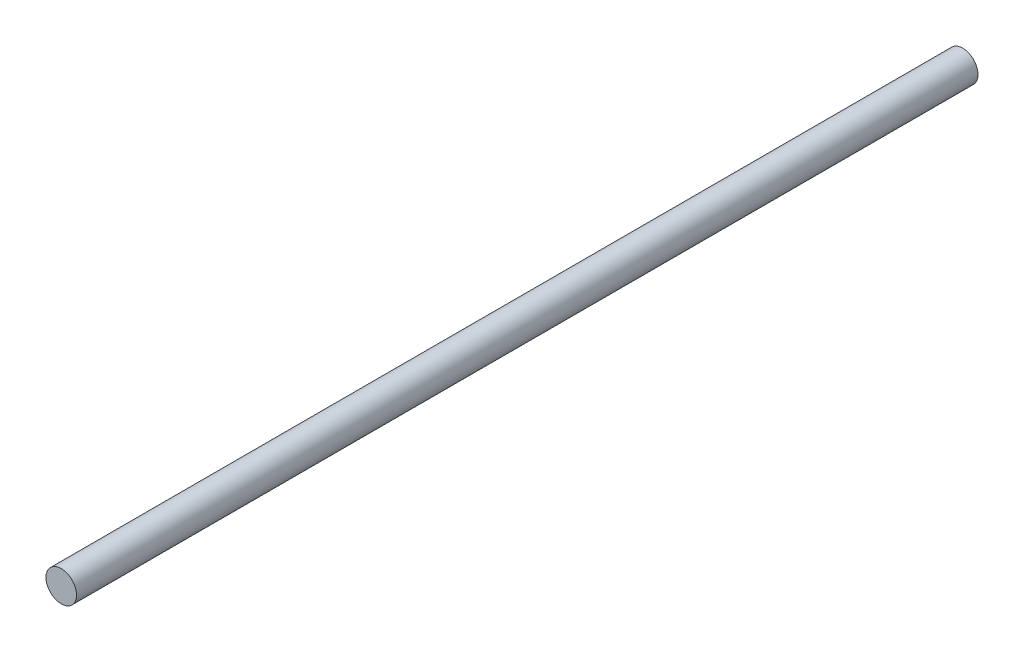
ISO-10303-21;
HEADER;
FILE_DESCRIPTION(('STEP AP214'),'2;1');
FILE_NAME('part.step','',(''),(''),'','','');
FILE_SCHEMA(('AUTOMOTIVE_DESIGN { 1 0 10303 214 1 1 1 1 }'));
ENDSEC;
DATA;
#1=APPLICATION_CONTEXT('core data for automotive mechanical design processes');
#2=APPLICATION_PROTOCOL_DEFINITION('international standard','automotive_design',2000,#1);
#3=PRODUCT_CONTEXT('',#1,'mechanical');
#4=PRODUCT('Part','Part','',(#3));
#5=PRODUCT_RELATED_PRODUCT_CATEGORY('part','',(#4));
#6=PRODUCT_DEFINITION_FORMATION('','',#4);
#7=PRODUCT_DEFINITION_CONTEXT('part definition',#1,'design');
#8=PRODUCT_DEFINITION('design','',#6,#7);
#9=PRODUCT_DEFINITION_SHAPE('','',#8);
#10=(LENGTH_UNIT() NAMED_UNIT(*) SI_UNIT(.MILLI.,.METRE.));
#11=(NAMED_UNIT(*) PLANE_ANGLE_UNIT() SI_UNIT($,.RADIAN.));
#12=(NAMED_UNIT(*) SI_UNIT($,.STERADIAN.) SOLID_ANGLE_UNIT());
#13=UNCERTAINTY_MEASURE_WITH_UNIT(LENGTH_MEASURE(1.E-05),#10,'distance_accuracy_value','');
#14=(GEOMETRIC_REPRESENTATION_CONTEXT(3) GLOBAL_UNCERTAINTY_ASSIGNED_CONTEXT((#13)) GLOBAL_UNIT_ASSIGNED_CONTEXT((#10,
#11,#12)) REPRESENTATION_CONTEXT('',''));
#15=CARTESIAN_POINT('',(0.,0.,0.));
#16=DIRECTION('',(0.,0.,1.));
#17=DIRECTION('',(1.,0.,0.));
#18=AXIS2_PLACEMENT_3D('',#15,#16,#17);
#19=CARTESIAN_POINT('',(11.5000000000011,-184.674624292413,-270.));
#20=DIRECTION('',(0.,0.,1.));
#21=DIRECTION('',(1.,0.,0.));
#22=AXIS2_PLACEMENT_3D('',#19,#20,#21);
#23=CYLINDRICAL_SURFACE('',#22,5.);
#24=CARTESIAN_POINT('',(11.5000000000011,-184.674624292413,-270.));
#25=DIRECTION('',(0.,0.,1.));
#26=DIRECTION('',(1.,0.,0.));
#27=AXIS2_PLACEMENT_3D('',#24,#25,#26);
#28=CIRCLE('',#27,5.);
#29=CARTESIAN_POINT('',(16.5000000000011,-184.674624292413,-270.));
#30=VERTEX_POINT('',#29);
#31=EDGE_CURVE('E10',#30,#30,#28,.T.);
#32=ORIENTED_EDGE('',*,*,#31,.T.);
#33=EDGE_LOOP('',(#32));
#34=FACE_BOUND('',#33,.T.);
#35=CARTESIAN_POINT('',(11.5000000000011,-184.674624292413,25.));
#36=DIRECTION('',(0.,0.,1.));
#37=DIRECTION('',(1.,0.,0.));
#38=AXIS2_PLACEMENT_3D('',#35,#36,#37);
#39=CIRCLE('',#38,5.);
#40=CARTESIAN_POINT('',(16.5000000000011,-184.674624292413,25.));
#41=VERTEX_POINT('',#40);
#42=EDGE_CURVE('E37',#41,#41,#39,.T.);
#43=ORIENTED_EDGE('',*,*,#42,.F.);
#44=EDGE_LOOP('',(#43));
#45=FACE_BOUND('',#44,.T.);
#46=ADVANCED_FACE('F31',(#34,#45),#23,.T.);
#47=CARTESIAN_POINT('',(11.5000000000011,-184.674624292413,-270.));
#48=DIRECTION('',(0.,0.,1.));
#49=DIRECTION('',(1.,0.,0.));
#50=AXIS2_PLACEMENT_3D('',#47,#48,#49);
#51=PLANE('',#50);
#52=ORIENTED_EDGE('',*,*,#31,.F.);
#53=EDGE_LOOP('',(#52));
#54=FACE_BOUND('',#53,.T.);
#55=ADVANCED_FACE('F46',(#54),#51,.F.);
#56=CARTESIAN_POINT('',(11.5000000000011,-184.674624292413,25.));
#57=DIRECTION('',(0.,0.,1.));
#58=DIRECTION('',(1.,0.,0.));
#59=AXIS2_PLACEMENT_3D('',#56,#57,#58);
#60=PLANE('',#59);
#61=ORIENTED_EDGE('',*,*,#42,.T.);
#62=EDGE_LOOP('',(#61));
#63=FACE_BOUND('',#62,.T.);
#64=ADVANCED_FACE('F43',(#63),#60,.T.);
#65=CLOSED_SHELL('',(#46,#55,#64));
#66=MANIFOLD_SOLID_BREP('B2',#65);
#67=ADVANCED_BREP_SHAPE_REPRESENTATION('',(#18,#66),#14);
#68=SHAPE_DEFINITION_REPRESENTATION(#9,#67);
ENDSEC;
END-ISO-10303-21;
